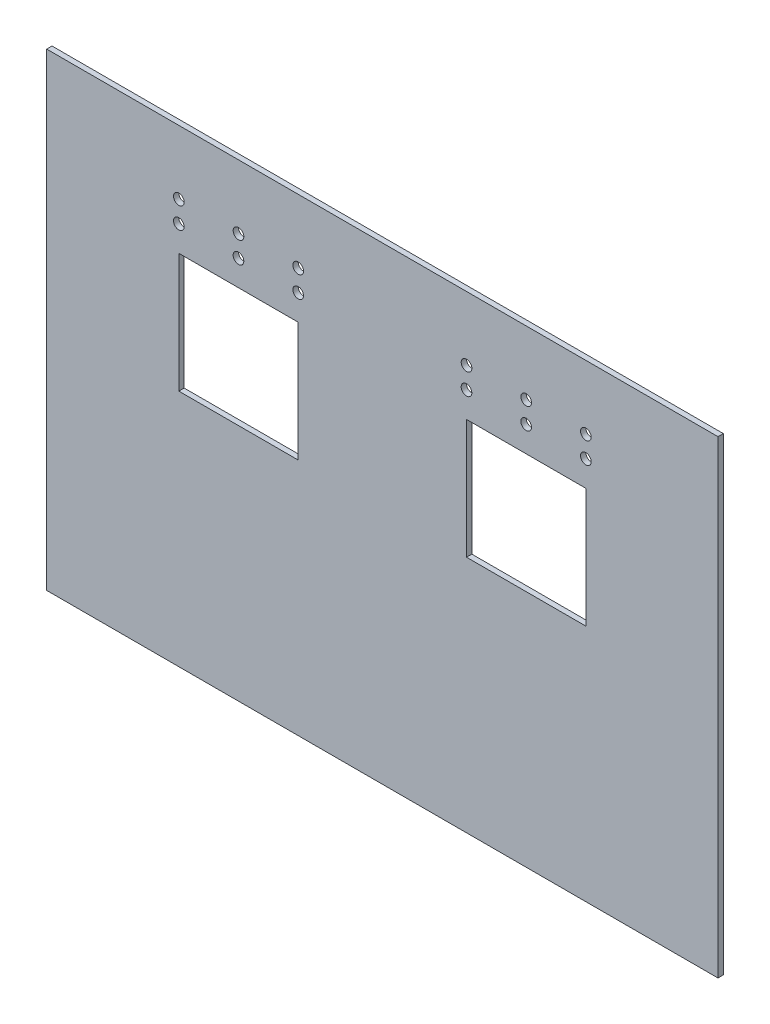
ISO-10303-21;
HEADER;
FILE_DESCRIPTION(('STEP AP214'),'2;1');
FILE_NAME('part.step','',(''),(''),'','','');
FILE_SCHEMA(('AUTOMOTIVE_DESIGN { 1 0 10303 214 1 1 1 1 }'));
ENDSEC;
DATA;
#1=APPLICATION_CONTEXT('core data for automotive mechanical design processes');
#2=APPLICATION_PROTOCOL_DEFINITION('international standard','automotive_design',2000,#1);
#3=PRODUCT_CONTEXT('',#1,'mechanical');
#4=PRODUCT('Part','Part','',(#3));
#5=PRODUCT_RELATED_PRODUCT_CATEGORY('part','',(#4));
#6=PRODUCT_DEFINITION_FORMATION('','',#4);
#7=PRODUCT_DEFINITION_CONTEXT('part definition',#1,'design');
#8=PRODUCT_DEFINITION('design','',#6,#7);
#9=PRODUCT_DEFINITION_SHAPE('','',#8);
#10=(LENGTH_UNIT() NAMED_UNIT(*) SI_UNIT(.MILLI.,.METRE.));
#11=(NAMED_UNIT(*) PLANE_ANGLE_UNIT() SI_UNIT($,.RADIAN.));
#12=(NAMED_UNIT(*) SI_UNIT($,.STERADIAN.) SOLID_ANGLE_UNIT());
#13=UNCERTAINTY_MEASURE_WITH_UNIT(LENGTH_MEASURE(1.E-05),#10,'distance_accuracy_value','');
#14=(GEOMETRIC_REPRESENTATION_CONTEXT(3) GLOBAL_UNCERTAINTY_ASSIGNED_CONTEXT((#13)) GLOBAL_UNIT_ASSIGNED_CONTEXT((#10,
#11,#12)) REPRESENTATION_CONTEXT('',''));
#15=CARTESIAN_POINT('',(0.,0.,0.));
#16=DIRECTION('',(0.,0.,1.));
#17=DIRECTION('',(1.,0.,0.));
#18=AXIS2_PLACEMENT_3D('',#15,#16,#17);
#19=CARTESIAN_POINT('',(0.,0.,3.175));
#20=DIRECTION('',(0.,0.,1.));
#21=DIRECTION('',(1.,0.,0.));
#22=AXIS2_PLACEMENT_3D('',#19,#20,#21);
#23=PLANE('',#22);
#24=CARTESIAN_POINT('',(85.7249999999999,101.6,3.175));
#25=DIRECTION('',(0.,0.,1.));
#26=DIRECTION('',(-1.,0.,0.));
#27=AXIS2_PLACEMENT_3D('',#24,#25,#26);
#28=CIRCLE('',#27,3.175);
#29=CARTESIAN_POINT('',(82.5499999999999,101.6,3.175));
#30=VERTEX_POINT('',#29);
#31=EDGE_CURVE('E363',#30,#30,#28,.T.);
#32=ORIENTED_EDGE('',*,*,#31,.F.);
#33=EDGE_LOOP('',(#32));
#34=FACE_BOUND('',#33,.T.);
#35=CARTESIAN_POINT('',(50.1649999999999,88.9,3.175));
#36=DIRECTION('',(0.,0.,1.));
#37=DIRECTION('',(-1.,0.,0.));
#38=AXIS2_PLACEMENT_3D('',#35,#36,#37);
#39=CIRCLE('',#38,3.175);
#40=CARTESIAN_POINT('',(46.9899999999999,88.9,3.175));
#41=VERTEX_POINT('',#40);
#42=EDGE_CURVE('E375',#41,#41,#39,.T.);
#43=ORIENTED_EDGE('',*,*,#42,.F.);
#44=EDGE_LOOP('',(#43));
#45=FACE_BOUND('',#44,.T.);
#46=CARTESIAN_POINT('',(121.285,88.9,3.175));
#47=DIRECTION('',(0.,0.,1.));
#48=DIRECTION('',(-1.,0.,0.));
#49=AXIS2_PLACEMENT_3D('',#46,#47,#48);
#50=CIRCLE('',#49,3.175);
#51=CARTESIAN_POINT('',(118.11,88.9,3.175));
#52=VERTEX_POINT('',#51);
#53=EDGE_CURVE('E387',#52,#52,#50,.T.);
#54=ORIENTED_EDGE('',*,*,#53,.F.);
#55=EDGE_LOOP('',(#54));
#56=FACE_BOUND('',#55,.T.);
#57=CARTESIAN_POINT('',(-85.7249999999999,101.6,3.175));
#58=DIRECTION('',(0.,0.,1.));
#59=DIRECTION('',(1.,0.,0.));
#60=AXIS2_PLACEMENT_3D('',#57,#58,#59);
#61=CIRCLE('',#60,3.175);
#62=CARTESIAN_POINT('',(-82.5499999999999,101.6,3.175));
#63=VERTEX_POINT('',#62);
#64=EDGE_CURVE('E399',#63,#63,#61,.T.);
#65=ORIENTED_EDGE('',*,*,#64,.F.);
#66=EDGE_LOOP('',(#65));
#67=FACE_BOUND('',#66,.T.);
#68=CARTESIAN_POINT('',(-50.1649999999999,88.9,3.175));
#69=DIRECTION('',(0.,0.,1.));
#70=DIRECTION('',(1.,0.,0.));
#71=AXIS2_PLACEMENT_3D('',#68,#69,#70);
#72=CIRCLE('',#71,3.175);
#73=CARTESIAN_POINT('',(-46.9899999999999,88.9,3.175));
#74=VERTEX_POINT('',#73);
#75=EDGE_CURVE('E411',#74,#74,#72,.T.);
#76=ORIENTED_EDGE('',*,*,#75,.F.);
#77=EDGE_LOOP('',(#76));
#78=FACE_BOUND('',#77,.T.);
#79=CARTESIAN_POINT('',(-85.7249999999999,88.9,3.175));
#80=DIRECTION('',(0.,0.,1.));
#81=DIRECTION('',(1.,0.,0.));
#82=AXIS2_PLACEMENT_3D('',#79,#80,#81);
#83=CIRCLE('',#82,3.175);
#84=CARTESIAN_POINT('',(-82.5499999999999,88.9,3.175));
#85=VERTEX_POINT('',#84);
#86=EDGE_CURVE('E155',#85,#85,#83,.T.);
#87=ORIENTED_EDGE('',*,*,#86,.F.);
#88=EDGE_LOOP('',(#87));
#89=FACE_BOUND('',#88,.T.);
#90=DIRECTION('',(0.,1.,0.));
#91=VECTOR('',#90,1.);
#92=CARTESIAN_POINT('',(200.025,139.7,3.175));
#93=LINE('',#92,#91);
#94=CARTESIAN_POINT('',(200.025,-139.7,3.175));
#95=VERTEX_POINT('',#94);
#96=CARTESIAN_POINT('',(200.025,139.7,3.175));
#97=VERTEX_POINT('',#96);
#98=EDGE_CURVE('E196',#95,#97,#93,.T.);
#99=ORIENTED_EDGE('',*,*,#98,.T.);
#100=DIRECTION('',(-1.,0.,0.));
#101=VECTOR('',#100,1.);
#102=CARTESIAN_POINT('',(-200.025,139.7,3.175));
#103=LINE('',#102,#101);
#104=CARTESIAN_POINT('',(-200.025,139.7,3.175));
#105=VERTEX_POINT('',#104);
#106=EDGE_CURVE('E199',#97,#105,#103,.T.);
#107=ORIENTED_EDGE('',*,*,#106,.T.);
#108=DIRECTION('',(0.,-1.,0.));
#109=VECTOR('',#108,1.);
#110=CARTESIAN_POINT('',(-200.025,139.7,3.175));
#111=LINE('',#110,#109);
#112=CARTESIAN_POINT('',(-200.025,-139.7,3.175));
#113=VERTEX_POINT('',#112);
#114=EDGE_CURVE('E202',#105,#113,#111,.T.);
#115=ORIENTED_EDGE('',*,*,#114,.T.);
#116=DIRECTION('',(1.,0.,0.));
#117=VECTOR('',#116,1.);
#118=CARTESIAN_POINT('',(-200.025,-139.7,3.175));
#119=LINE('',#118,#117);
#120=EDGE_CURVE('E204',#113,#95,#119,.T.);
#121=ORIENTED_EDGE('',*,*,#120,.T.);
#122=EDGE_LOOP('',(#99,#107,#115,#121));
#123=FACE_BOUND('',#122,.T.);
#124=DIRECTION('',(-1.,0.,0.));
#125=VECTOR('',#124,1.);
#126=CARTESIAN_POINT('',(-121.285,73.66,3.175));
#127=LINE('',#126,#125);
#128=CARTESIAN_POINT('',(-50.1649999999999,73.66,3.175));
#129=VERTEX_POINT('',#128);
#130=CARTESIAN_POINT('',(-121.285,73.66,3.175));
#131=VERTEX_POINT('',#130);
#132=EDGE_CURVE('E167',#129,#131,#127,.T.);
#133=ORIENTED_EDGE('',*,*,#132,.F.);
#134=DIRECTION('',(0.,1.,0.));
#135=VECTOR('',#134,1.);
#136=CARTESIAN_POINT('',(-50.1649999999999,73.66,3.175));
#137=LINE('',#136,#135);
#138=CARTESIAN_POINT('',(-50.1649999999999,2.53999999999999,3.175));
#139=VERTEX_POINT('',#138);
#140=EDGE_CURVE('E165',#139,#129,#137,.T.);
#141=ORIENTED_EDGE('',*,*,#140,.F.);
#142=DIRECTION('',(1.,0.,0.));
#143=VECTOR('',#142,1.);
#144=CARTESIAN_POINT('',(-121.285,2.53999999999999,3.175));
#145=LINE('',#144,#143);
#146=CARTESIAN_POINT('',(-121.285,2.53999999999999,3.175));
#147=VERTEX_POINT('',#146);
#148=EDGE_CURVE('E173',#147,#139,#145,.T.);
#149=ORIENTED_EDGE('',*,*,#148,.F.);
#150=DIRECTION('',(0.,-1.,0.));
#151=VECTOR('',#150,1.);
#152=CARTESIAN_POINT('',(-121.285,73.66,3.175));
#153=LINE('',#152,#151);
#154=EDGE_CURVE('E170',#131,#147,#153,.T.);
#155=ORIENTED_EDGE('',*,*,#154,.F.);
#156=EDGE_LOOP('',(#133,#141,#149,#155));
#157=FACE_BOUND('',#156,.T.);
#158=DIRECTION('',(-1.,0.,0.));
#159=VECTOR('',#158,1.);
#160=CARTESIAN_POINT('',(121.285,73.66,3.175));
#161=LINE('',#160,#159);
#162=CARTESIAN_POINT('',(121.285,73.66,3.175));
#163=VERTEX_POINT('',#162);
#164=CARTESIAN_POINT('',(50.1649999999999,73.66,3.175));
#165=VERTEX_POINT('',#164);
#166=EDGE_CURVE('E134',#163,#165,#161,.T.);
#167=ORIENTED_EDGE('',*,*,#166,.F.);
#168=DIRECTION('',(0.,1.,0.));
#169=VECTOR('',#168,1.);
#170=CARTESIAN_POINT('',(121.285,73.66,3.175));
#171=LINE('',#170,#169);
#172=CARTESIAN_POINT('',(121.285,2.53999999999999,3.175));
#173=VERTEX_POINT('',#172);
#174=EDGE_CURVE('E126',#173,#163,#171,.T.);
#175=ORIENTED_EDGE('',*,*,#174,.F.);
#176=DIRECTION('',(1.,0.,0.));
#177=VECTOR('',#176,1.);
#178=CARTESIAN_POINT('',(121.285,2.53999999999999,3.175));
#179=LINE('',#178,#177);
#180=CARTESIAN_POINT('',(50.1649999999999,2.53999999999999,3.175));
#181=VERTEX_POINT('',#180);
#182=EDGE_CURVE('E149',#181,#173,#179,.T.);
#183=ORIENTED_EDGE('',*,*,#182,.F.);
#184=DIRECTION('',(0.,-1.,0.));
#185=VECTOR('',#184,1.);
#186=CARTESIAN_POINT('',(50.1649999999999,73.66,3.175));
#187=LINE('',#186,#185);
#188=EDGE_CURVE('E147',#165,#181,#187,.T.);
#189=ORIENTED_EDGE('',*,*,#188,.F.);
#190=EDGE_LOOP('',(#167,#175,#183,#189));
#191=FACE_BOUND('',#190,.T.);
#192=CARTESIAN_POINT('',(-121.285,88.9,3.175));
#193=DIRECTION('',(0.,0.,1.));
#194=DIRECTION('',(1.,0.,0.));
#195=AXIS2_PLACEMENT_3D('',#192,#193,#194);
#196=CIRCLE('',#195,3.175);
#197=CARTESIAN_POINT('',(-118.11,88.9,3.175));
#198=VERTEX_POINT('',#197);
#199=EDGE_CURVE('E417',#198,#198,#196,.T.);
#200=ORIENTED_EDGE('',*,*,#199,.F.);
#201=EDGE_LOOP('',(#200));
#202=FACE_BOUND('',#201,.T.);
#203=CARTESIAN_POINT('',(-50.1649999999999,101.6,3.175));
#204=DIRECTION('',(0.,0.,1.));
#205=DIRECTION('',(1.,0.,0.));
#206=AXIS2_PLACEMENT_3D('',#203,#204,#205);
#207=CIRCLE('',#206,3.175);
#208=CARTESIAN_POINT('',(-46.9899999999999,101.6,3.175));
#209=VERTEX_POINT('',#208);
#210=EDGE_CURVE('E405',#209,#209,#207,.T.);
#211=ORIENTED_EDGE('',*,*,#210,.F.);
#212=EDGE_LOOP('',(#211));
#213=FACE_BOUND('',#212,.T.);
#214=CARTESIAN_POINT('',(-121.285,101.6,3.175));
#215=DIRECTION('',(0.,0.,1.));
#216=DIRECTION('',(1.,0.,0.));
#217=AXIS2_PLACEMENT_3D('',#214,#215,#216);
#218=CIRCLE('',#217,3.175);
#219=CARTESIAN_POINT('',(-118.11,101.6,3.175));
#220=VERTEX_POINT('',#219);
#221=EDGE_CURVE('E393',#220,#220,#218,.T.);
#222=ORIENTED_EDGE('',*,*,#221,.F.);
#223=EDGE_LOOP('',(#222));
#224=FACE_BOUND('',#223,.T.);
#225=CARTESIAN_POINT('',(85.7249999999999,88.9,3.175));
#226=DIRECTION('',(0.,0.,1.));
#227=DIRECTION('',(-1.,0.,0.));
#228=AXIS2_PLACEMENT_3D('',#225,#226,#227);
#229=CIRCLE('',#228,3.175);
#230=CARTESIAN_POINT('',(82.5499999999999,88.9,3.175));
#231=VERTEX_POINT('',#230);
#232=EDGE_CURVE('E381',#231,#231,#229,.T.);
#233=ORIENTED_EDGE('',*,*,#232,.F.);
#234=EDGE_LOOP('',(#233));
#235=FACE_BOUND('',#234,.T.);
#236=CARTESIAN_POINT('',(50.1649999999999,101.6,3.175));
#237=DIRECTION('',(0.,0.,1.));
#238=DIRECTION('',(-1.,0.,0.));
#239=AXIS2_PLACEMENT_3D('',#236,#237,#238);
#240=CIRCLE('',#239,3.175);
#241=CARTESIAN_POINT('',(46.9899999999999,101.6,3.175));
#242=VERTEX_POINT('',#241);
#243=EDGE_CURVE('E369',#242,#242,#240,.T.);
#244=ORIENTED_EDGE('',*,*,#243,.F.);
#245=EDGE_LOOP('',(#244));
#246=FACE_BOUND('',#245,.T.);
#247=CARTESIAN_POINT('',(121.285,101.6,3.175));
#248=DIRECTION('',(0.,0.,1.));
#249=DIRECTION('',(-1.,0.,0.));
#250=AXIS2_PLACEMENT_3D('',#247,#248,#249);
#251=CIRCLE('',#250,3.175);
#252=CARTESIAN_POINT('',(118.11,101.6,3.175));
#253=VERTEX_POINT('',#252);
#254=EDGE_CURVE('E354',#253,#253,#251,.T.);
#255=ORIENTED_EDGE('',*,*,#254,.F.);
#256=EDGE_LOOP('',(#255));
#257=FACE_BOUND('',#256,.T.);
#258=ADVANCED_FACE('F37',(#34,#45,#56,#67,#78,#89,#123,#157,#191,#202,#213,#224,#235,#246,#257),
#23,.T.);
#259=CARTESIAN_POINT('',(0.,0.,0.));
#260=DIRECTION('',(0.,0.,1.));
#261=DIRECTION('',(1.,0.,0.));
#262=AXIS2_PLACEMENT_3D('',#259,#260,#261);
#263=PLANE('',#262);
#264=DIRECTION('',(0.,1.,0.));
#265=VECTOR('',#264,1.);
#266=CARTESIAN_POINT('',(-50.1649999999999,73.66,0.));
#267=LINE('',#266,#265);
#268=CARTESIAN_POINT('',(-50.1649999999999,2.53999999999999,0.));
#269=VERTEX_POINT('',#268);
#270=CARTESIAN_POINT('',(-50.1649999999999,73.66,0.));
#271=VERTEX_POINT('',#270);
#272=EDGE_CURVE('E142',#269,#271,#267,.T.);
#273=ORIENTED_EDGE('',*,*,#272,.T.);
#274=DIRECTION('',(-1.,0.,0.));
#275=VECTOR('',#274,1.);
#276=CARTESIAN_POINT('',(-121.285,73.66,0.));
#277=LINE('',#276,#275);
#278=CARTESIAN_POINT('',(-121.285,73.66,0.));
#279=VERTEX_POINT('',#278);
#280=EDGE_CURVE('E178',#271,#279,#277,.T.);
#281=ORIENTED_EDGE('',*,*,#280,.T.);
#282=DIRECTION('',(0.,-1.,0.));
#283=VECTOR('',#282,1.);
#284=CARTESIAN_POINT('',(-121.285,73.66,0.));
#285=LINE('',#284,#283);
#286=CARTESIAN_POINT('',(-121.285,2.53999999999999,0.));
#287=VERTEX_POINT('',#286);
#288=EDGE_CURVE('E181',#279,#287,#285,.T.);
#289=ORIENTED_EDGE('',*,*,#288,.T.);
#290=DIRECTION('',(1.,0.,0.));
#291=VECTOR('',#290,1.);
#292=CARTESIAN_POINT('',(-121.285,2.53999999999999,0.));
#293=LINE('',#292,#291);
#294=EDGE_CURVE('E168',#287,#269,#293,.T.);
#295=ORIENTED_EDGE('',*,*,#294,.T.);
#296=EDGE_LOOP('',(#273,#281,#289,#295));
#297=FACE_BOUND('',#296,.T.);
#298=DIRECTION('',(0.,1.,0.));
#299=VECTOR('',#298,1.);
#300=CARTESIAN_POINT('',(200.025,139.7,0.));
#301=LINE('',#300,#299);
#302=CARTESIAN_POINT('',(200.025,-139.7,0.));
#303=VERTEX_POINT('',#302);
#304=CARTESIAN_POINT('',(200.025,139.7,0.));
#305=VERTEX_POINT('',#304);
#306=EDGE_CURVE('E195',#303,#305,#301,.T.);
#307=ORIENTED_EDGE('',*,*,#306,.F.);
#308=DIRECTION('',(1.,0.,0.));
#309=VECTOR('',#308,1.);
#310=CARTESIAN_POINT('',(-200.025,-139.7,0.));
#311=LINE('',#310,#309);
#312=CARTESIAN_POINT('',(-200.025,-139.7,0.));
#313=VERTEX_POINT('',#312);
#314=EDGE_CURVE('E200',#313,#303,#311,.T.);
#315=ORIENTED_EDGE('',*,*,#314,.F.);
#316=DIRECTION('',(0.,-1.,0.));
#317=VECTOR('',#316,1.);
#318=CARTESIAN_POINT('',(-200.025,139.7,0.));
#319=LINE('',#318,#317);
#320=CARTESIAN_POINT('',(-200.025,139.7,0.));
#321=VERTEX_POINT('',#320);
#322=EDGE_CURVE('E211',#321,#313,#319,.T.);
#323=ORIENTED_EDGE('',*,*,#322,.F.);
#324=DIRECTION('',(-1.,0.,0.));
#325=VECTOR('',#324,1.);
#326=CARTESIAN_POINT('',(-200.025,139.7,0.));
#327=LINE('',#326,#325);
#328=EDGE_CURVE('E209',#305,#321,#327,.T.);
#329=ORIENTED_EDGE('',*,*,#328,.F.);
#330=EDGE_LOOP('',(#307,#315,#323,#329));
#331=FACE_BOUND('',#330,.T.);
#332=DIRECTION('',(0.,1.,0.));
#333=VECTOR('',#332,1.);
#334=CARTESIAN_POINT('',(121.285,73.66,0.));
#335=LINE('',#334,#333);
#336=CARTESIAN_POINT('',(121.285,2.53999999999999,0.));
#337=VERTEX_POINT('',#336);
#338=CARTESIAN_POINT('',(121.285,73.66,0.));
#339=VERTEX_POINT('',#338);
#340=EDGE_CURVE('E60',#337,#339,#335,.T.);
#341=ORIENTED_EDGE('',*,*,#340,.T.);
#342=DIRECTION('',(-1.,0.,0.));
#343=VECTOR('',#342,1.);
#344=CARTESIAN_POINT('',(121.285,73.66,0.));
#345=LINE('',#344,#343);
#346=CARTESIAN_POINT('',(50.1649999999999,73.66,0.));
#347=VERTEX_POINT('',#346);
#348=EDGE_CURVE('E141',#339,#347,#345,.T.);
#349=ORIENTED_EDGE('',*,*,#348,.T.);
#350=DIRECTION('',(0.,-1.,0.));
#351=VECTOR('',#350,1.);
#352=CARTESIAN_POINT('',(50.1649999999999,73.66,0.));
#353=LINE('',#352,#351);
#354=CARTESIAN_POINT('',(50.1649999999999,2.53999999999999,0.));
#355=VERTEX_POINT('',#354);
#356=EDGE_CURVE('E157',#347,#355,#353,.T.);
#357=ORIENTED_EDGE('',*,*,#356,.T.);
#358=DIRECTION('',(1.,0.,0.));
#359=VECTOR('',#358,1.);
#360=CARTESIAN_POINT('',(121.285,2.53999999999999,0.));
#361=LINE('',#360,#359);
#362=EDGE_CURVE('E135',#355,#337,#361,.T.);
#363=ORIENTED_EDGE('',*,*,#362,.T.);
#364=EDGE_LOOP('',(#341,#349,#357,#363));
#365=FACE_BOUND('',#364,.T.);
#366=CARTESIAN_POINT('',(-85.7249999999999,88.9,0.));
#367=DIRECTION('',(0.,0.,1.));
#368=DIRECTION('',(1.,0.,0.));
#369=AXIS2_PLACEMENT_3D('',#366,#367,#368);
#370=CIRCLE('',#369,3.175);
#371=CARTESIAN_POINT('',(-82.5499999999999,88.9,0.));
#372=VERTEX_POINT('',#371);
#373=EDGE_CURVE('E420',#372,#372,#370,.T.);
#374=ORIENTED_EDGE('',*,*,#373,.T.);
#375=EDGE_LOOP('',(#374));
#376=FACE_BOUND('',#375,.T.);
#377=CARTESIAN_POINT('',(-121.285,88.9,0.));
#378=DIRECTION('',(0.,0.,1.));
#379=DIRECTION('',(1.,0.,0.));
#380=AXIS2_PLACEMENT_3D('',#377,#378,#379);
#381=CIRCLE('',#380,3.175);
#382=CARTESIAN_POINT('',(-118.11,88.9,0.));
#383=VERTEX_POINT('',#382);
#384=EDGE_CURVE('E414',#383,#383,#381,.T.);
#385=ORIENTED_EDGE('',*,*,#384,.T.);
#386=EDGE_LOOP('',(#385));
#387=FACE_BOUND('',#386,.T.);
#388=CARTESIAN_POINT('',(-50.1649999999999,88.9,0.));
#389=DIRECTION('',(0.,0.,1.));
#390=DIRECTION('',(1.,0.,0.));
#391=AXIS2_PLACEMENT_3D('',#388,#389,#390);
#392=CIRCLE('',#391,3.175);
#393=CARTESIAN_POINT('',(-46.9899999999999,88.9,0.));
#394=VERTEX_POINT('',#393);
#395=EDGE_CURVE('E408',#394,#394,#392,.T.);
#396=ORIENTED_EDGE('',*,*,#395,.T.);
#397=EDGE_LOOP('',(#396));
#398=FACE_BOUND('',#397,.T.);
#399=CARTESIAN_POINT('',(-50.1649999999999,101.6,0.));
#400=DIRECTION('',(0.,0.,1.));
#401=DIRECTION('',(1.,0.,0.));
#402=AXIS2_PLACEMENT_3D('',#399,#400,#401);
#403=CIRCLE('',#402,3.175);
#404=CARTESIAN_POINT('',(-46.9899999999999,101.6,0.));
#405=VERTEX_POINT('',#404);
#406=EDGE_CURVE('E402',#405,#405,#403,.T.);
#407=ORIENTED_EDGE('',*,*,#406,.T.);
#408=EDGE_LOOP('',(#407));
#409=FACE_BOUND('',#408,.T.);
#410=CARTESIAN_POINT('',(-85.7249999999999,101.6,0.));
#411=DIRECTION('',(0.,0.,1.));
#412=DIRECTION('',(1.,0.,0.));
#413=AXIS2_PLACEMENT_3D('',#410,#411,#412);
#414=CIRCLE('',#413,3.175);
#415=CARTESIAN_POINT('',(-82.5499999999999,101.6,0.));
#416=VERTEX_POINT('',#415);
#417=EDGE_CURVE('E396',#416,#416,#414,.T.);
#418=ORIENTED_EDGE('',*,*,#417,.T.);
#419=EDGE_LOOP('',(#418));
#420=FACE_BOUND('',#419,.T.);
#421=CARTESIAN_POINT('',(-121.285,101.6,0.));
#422=DIRECTION('',(0.,0.,1.));
#423=DIRECTION('',(1.,0.,0.));
#424=AXIS2_PLACEMENT_3D('',#421,#422,#423);
#425=CIRCLE('',#424,3.175);
#426=CARTESIAN_POINT('',(-118.11,101.6,0.));
#427=VERTEX_POINT('',#426);
#428=EDGE_CURVE('E390',#427,#427,#425,.T.);
#429=ORIENTED_EDGE('',*,*,#428,.T.);
#430=EDGE_LOOP('',(#429));
#431=FACE_BOUND('',#430,.T.);
#432=CARTESIAN_POINT('',(121.285,88.9,0.));
#433=DIRECTION('',(0.,0.,1.));
#434=DIRECTION('',(-1.,0.,0.));
#435=AXIS2_PLACEMENT_3D('',#432,#433,#434);
#436=CIRCLE('',#435,3.175);
#437=CARTESIAN_POINT('',(118.11,88.9,0.));
#438=VERTEX_POINT('',#437);
#439=EDGE_CURVE('E384',#438,#438,#436,.T.);
#440=ORIENTED_EDGE('',*,*,#439,.T.);
#441=EDGE_LOOP('',(#440));
#442=FACE_BOUND('',#441,.T.);
#443=CARTESIAN_POINT('',(85.7249999999999,88.9,0.));
#444=DIRECTION('',(0.,0.,1.));
#445=DIRECTION('',(-1.,0.,0.));
#446=AXIS2_PLACEMENT_3D('',#443,#444,#445);
#447=CIRCLE('',#446,3.175);
#448=CARTESIAN_POINT('',(82.5499999999999,88.9,0.));
#449=VERTEX_POINT('',#448);
#450=EDGE_CURVE('E378',#449,#449,#447,.T.);
#451=ORIENTED_EDGE('',*,*,#450,.T.);
#452=EDGE_LOOP('',(#451));
#453=FACE_BOUND('',#452,.T.);
#454=CARTESIAN_POINT('',(50.1649999999999,88.9,0.));
#455=DIRECTION('',(0.,0.,1.));
#456=DIRECTION('',(-1.,0.,0.));
#457=AXIS2_PLACEMENT_3D('',#454,#455,#456);
#458=CIRCLE('',#457,3.175);
#459=CARTESIAN_POINT('',(46.9899999999999,88.9,0.));
#460=VERTEX_POINT('',#459);
#461=EDGE_CURVE('E372',#460,#460,#458,.T.);
#462=ORIENTED_EDGE('',*,*,#461,.T.);
#463=EDGE_LOOP('',(#462));
#464=FACE_BOUND('',#463,.T.);
#465=CARTESIAN_POINT('',(50.1649999999999,101.6,0.));
#466=DIRECTION('',(0.,0.,1.));
#467=DIRECTION('',(-1.,0.,0.));
#468=AXIS2_PLACEMENT_3D('',#465,#466,#467);
#469=CIRCLE('',#468,3.175);
#470=CARTESIAN_POINT('',(46.9899999999999,101.6,0.));
#471=VERTEX_POINT('',#470);
#472=EDGE_CURVE('E366',#471,#471,#469,.T.);
#473=ORIENTED_EDGE('',*,*,#472,.T.);
#474=EDGE_LOOP('',(#473));
#475=FACE_BOUND('',#474,.T.);
#476=CARTESIAN_POINT('',(85.7249999999999,101.6,0.));
#477=DIRECTION('',(0.,0.,1.));
#478=DIRECTION('',(-1.,0.,0.));
#479=AXIS2_PLACEMENT_3D('',#476,#477,#478);
#480=CIRCLE('',#479,3.175);
#481=CARTESIAN_POINT('',(82.5499999999999,101.6,0.));
#482=VERTEX_POINT('',#481);
#483=EDGE_CURVE('E360',#482,#482,#480,.T.);
#484=ORIENTED_EDGE('',*,*,#483,.T.);
#485=EDGE_LOOP('',(#484));
#486=FACE_BOUND('',#485,.T.);
#487=CARTESIAN_POINT('',(121.285,101.6,0.));
#488=DIRECTION('',(0.,0.,1.));
#489=DIRECTION('',(-1.,0.,0.));
#490=AXIS2_PLACEMENT_3D('',#487,#488,#489);
#491=CIRCLE('',#490,3.175);
#492=CARTESIAN_POINT('',(118.11,101.6,0.));
#493=VERTEX_POINT('',#492);
#494=EDGE_CURVE('E357',#493,#493,#491,.T.);
#495=ORIENTED_EDGE('',*,*,#494,.T.);
#496=EDGE_LOOP('',(#495));
#497=FACE_BOUND('',#496,.T.);
#498=ADVANCED_FACE('F229',(#297,#331,#365,#376,#387,#398,#409,#420,#431,#442,#453,#464,#475,
#486,#497),#263,.F.);
#499=CARTESIAN_POINT('',(200.025,139.7,3.175));
#500=DIRECTION('',(-1.,0.,0.));
#501=DIRECTION('',(0.,-1.,0.));
#502=AXIS2_PLACEMENT_3D('',#499,#500,#501);
#503=PLANE('',#502);
#504=ORIENTED_EDGE('',*,*,#306,.T.);
#505=DIRECTION('',(0.,0.,-1.));
#506=VECTOR('',#505,1.);
#507=CARTESIAN_POINT('',(200.025,139.7,3.175));
#508=LINE('',#507,#506);
#509=EDGE_CURVE('E11',#97,#305,#508,.T.);
#510=ORIENTED_EDGE('',*,*,#509,.F.);
#511=ORIENTED_EDGE('',*,*,#98,.F.);
#512=DIRECTION('',(0.,0.,-1.));
#513=VECTOR('',#512,1.);
#514=CARTESIAN_POINT('',(200.025,-139.7,3.175));
#515=LINE('',#514,#513);
#516=EDGE_CURVE('E206',#95,#303,#515,.T.);
#517=ORIENTED_EDGE('',*,*,#516,.T.);
#518=EDGE_LOOP('',(#504,#510,#511,#517));
#519=FACE_BOUND('',#518,.T.);
#520=ADVANCED_FACE('F39',(#519),#503,.F.);
#521=CARTESIAN_POINT('',(-200.025,139.7,3.175));
#522=DIRECTION('',(0.,-1.,0.));
#523=DIRECTION('',(0.,0.,-1.));
#524=AXIS2_PLACEMENT_3D('',#521,#522,#523);
#525=PLANE('',#524);
#526=ORIENTED_EDGE('',*,*,#328,.T.);
#527=DIRECTION('',(0.,0.,-1.));
#528=VECTOR('',#527,1.);
#529=CARTESIAN_POINT('',(-200.025,139.7,3.175));
#530=LINE('',#529,#528);
#531=EDGE_CURVE('E45',#105,#321,#530,.T.);
#532=ORIENTED_EDGE('',*,*,#531,.F.);
#533=ORIENTED_EDGE('',*,*,#106,.F.);
#534=ORIENTED_EDGE('',*,*,#509,.T.);
#535=EDGE_LOOP('',(#526,#532,#533,#534));
#536=FACE_BOUND('',#535,.T.);
#537=ADVANCED_FACE('F240',(#536),#525,.F.);
#538=CARTESIAN_POINT('',(-200.025,139.7,3.175));
#539=DIRECTION('',(1.,0.,0.));
#540=DIRECTION('',(0.,0.,-1.));
#541=AXIS2_PLACEMENT_3D('',#538,#539,#540);
#542=PLANE('',#541);
#543=ORIENTED_EDGE('',*,*,#322,.T.);
#544=DIRECTION('',(0.,0.,-1.));
#545=VECTOR('',#544,1.);
#546=CARTESIAN_POINT('',(-200.025,-139.7,3.175));
#547=LINE('',#546,#545);
#548=EDGE_CURVE('E216',#113,#313,#547,.T.);
#549=ORIENTED_EDGE('',*,*,#548,.F.);
#550=ORIENTED_EDGE('',*,*,#114,.F.);
#551=ORIENTED_EDGE('',*,*,#531,.T.);
#552=EDGE_LOOP('',(#543,#549,#550,#551));
#553=FACE_BOUND('',#552,.T.);
#554=ADVANCED_FACE('F223',(#553),#542,.F.);
#555=CARTESIAN_POINT('',(-200.025,-139.7,3.175));
#556=DIRECTION('',(0.,1.,0.));
#557=DIRECTION('',(0.,0.,1.));
#558=AXIS2_PLACEMENT_3D('',#555,#556,#557);
#559=PLANE('',#558);
#560=ORIENTED_EDGE('',*,*,#314,.T.);
#561=ORIENTED_EDGE('',*,*,#516,.F.);
#562=ORIENTED_EDGE('',*,*,#120,.F.);
#563=ORIENTED_EDGE('',*,*,#548,.T.);
#564=EDGE_LOOP('',(#560,#561,#562,#563));
#565=FACE_BOUND('',#564,.T.);
#566=ADVANCED_FACE('F233',(#565),#559,.F.);
#567=CARTESIAN_POINT('',(-50.1649999999999,73.66,3.175));
#568=DIRECTION('',(-1.,0.,0.));
#569=DIRECTION('',(0.,-1.,0.));
#570=AXIS2_PLACEMENT_3D('',#567,#568,#569);
#571=PLANE('',#570);
#572=ORIENTED_EDGE('',*,*,#272,.F.);
#573=DIRECTION('',(0.,0.,-1.));
#574=VECTOR('',#573,1.);
#575=CARTESIAN_POINT('',(-50.1649999999999,2.53999999999999,3.175));
#576=LINE('',#575,#574);
#577=EDGE_CURVE('E175',#139,#269,#576,.T.);
#578=ORIENTED_EDGE('',*,*,#577,.F.);
#579=ORIENTED_EDGE('',*,*,#140,.T.);
#580=DIRECTION('',(0.,0.,-1.));
#581=VECTOR('',#580,1.);
#582=CARTESIAN_POINT('',(-50.1649999999999,73.66,3.175));
#583=LINE('',#582,#581);
#584=EDGE_CURVE('E192',#129,#271,#583,.T.);
#585=ORIENTED_EDGE('',*,*,#584,.T.);
#586=EDGE_LOOP('',(#572,#578,#579,#585));
#587=FACE_BOUND('',#586,.T.);
#588=ADVANCED_FACE('F258',(#587),#571,.T.);
#589=CARTESIAN_POINT('',(-121.285,73.66,3.175));
#590=DIRECTION('',(0.,-1.,0.));
#591=DIRECTION('',(0.,0.,-1.));
#592=AXIS2_PLACEMENT_3D('',#589,#590,#591);
#593=PLANE('',#592);
#594=ORIENTED_EDGE('',*,*,#280,.F.);
#595=ORIENTED_EDGE('',*,*,#584,.F.);
#596=ORIENTED_EDGE('',*,*,#132,.T.);
#597=DIRECTION('',(0.,0.,-1.));
#598=VECTOR('',#597,1.);
#599=CARTESIAN_POINT('',(-121.285,73.66,3.175));
#600=LINE('',#599,#598);
#601=EDGE_CURVE('E190',#131,#279,#600,.T.);
#602=ORIENTED_EDGE('',*,*,#601,.T.);
#603=EDGE_LOOP('',(#594,#595,#596,#602));
#604=FACE_BOUND('',#603,.T.);
#605=ADVANCED_FACE('F265',(#604),#593,.T.);
#606=CARTESIAN_POINT('',(-121.285,73.66,3.175));
#607=DIRECTION('',(1.,0.,0.));
#608=DIRECTION('',(0.,1.,0.));
#609=AXIS2_PLACEMENT_3D('',#606,#607,#608);
#610=PLANE('',#609);
#611=ORIENTED_EDGE('',*,*,#288,.F.);
#612=ORIENTED_EDGE('',*,*,#601,.F.);
#613=ORIENTED_EDGE('',*,*,#154,.T.);
#614=DIRECTION('',(0.,0.,-1.));
#615=VECTOR('',#614,1.);
#616=CARTESIAN_POINT('',(-121.285,2.53999999999999,3.175));
#617=LINE('',#616,#615);
#618=EDGE_CURVE('E188',#147,#287,#617,.T.);
#619=ORIENTED_EDGE('',*,*,#618,.T.);
#620=EDGE_LOOP('',(#611,#612,#613,#619));
#621=FACE_BOUND('',#620,.T.);
#622=ADVANCED_FACE('F270',(#621),#610,.T.);
#623=CARTESIAN_POINT('',(-121.285,2.53999999999999,3.175));
#624=DIRECTION('',(0.,1.,0.));
#625=DIRECTION('',(0.,0.,1.));
#626=AXIS2_PLACEMENT_3D('',#623,#624,#625);
#627=PLANE('',#626);
#628=ORIENTED_EDGE('',*,*,#294,.F.);
#629=ORIENTED_EDGE('',*,*,#618,.F.);
#630=ORIENTED_EDGE('',*,*,#148,.T.);
#631=ORIENTED_EDGE('',*,*,#577,.T.);
#632=EDGE_LOOP('',(#628,#629,#630,#631));
#633=FACE_BOUND('',#632,.T.);
#634=ADVANCED_FACE('F277',(#633),#627,.T.);
#635=CARTESIAN_POINT('',(121.285,73.66,3.175));
#636=DIRECTION('',(-1.,0.,0.));
#637=DIRECTION('',(0.,-1.,0.));
#638=AXIS2_PLACEMENT_3D('',#635,#636,#637);
#639=PLANE('',#638);
#640=ORIENTED_EDGE('',*,*,#340,.F.);
#641=DIRECTION('',(0.,0.,-1.));
#642=VECTOR('',#641,1.);
#643=CARTESIAN_POINT('',(121.285,2.53999999999999,3.175));
#644=LINE('',#643,#642);
#645=EDGE_CURVE('E130',#173,#337,#644,.T.);
#646=ORIENTED_EDGE('',*,*,#645,.F.);
#647=ORIENTED_EDGE('',*,*,#174,.T.);
#648=DIRECTION('',(0.,0.,-1.));
#649=VECTOR('',#648,1.);
#650=CARTESIAN_POINT('',(121.285,73.66,3.175));
#651=LINE('',#650,#649);
#652=EDGE_CURVE('E129',#163,#339,#651,.T.);
#653=ORIENTED_EDGE('',*,*,#652,.T.);
#654=EDGE_LOOP('',(#640,#646,#647,#653));
#655=FACE_BOUND('',#654,.T.);
#656=ADVANCED_FACE('F128',(#655),#639,.T.);
#657=CARTESIAN_POINT('',(121.285,73.66,3.175));
#658=DIRECTION('',(0.,-1.,0.));
#659=DIRECTION('',(0.,0.,-1.));
#660=AXIS2_PLACEMENT_3D('',#657,#658,#659);
#661=PLANE('',#660);
#662=ORIENTED_EDGE('',*,*,#348,.F.);
#663=ORIENTED_EDGE('',*,*,#652,.F.);
#664=ORIENTED_EDGE('',*,*,#166,.T.);
#665=DIRECTION('',(0.,0.,-1.));
#666=VECTOR('',#665,1.);
#667=CARTESIAN_POINT('',(50.1649999999999,73.66,3.175));
#668=LINE('',#667,#666);
#669=EDGE_CURVE('E143',#165,#347,#668,.T.);
#670=ORIENTED_EDGE('',*,*,#669,.T.);
#671=EDGE_LOOP('',(#662,#663,#664,#670));
#672=FACE_BOUND('',#671,.T.);
#673=ADVANCED_FACE('F138',(#672),#661,.T.);
#674=CARTESIAN_POINT('',(50.1649999999999,73.66,3.175));
#675=DIRECTION('',(1.,0.,0.));
#676=DIRECTION('',(0.,1.,0.));
#677=AXIS2_PLACEMENT_3D('',#674,#675,#676);
#678=PLANE('',#677);
#679=ORIENTED_EDGE('',*,*,#356,.F.);
#680=ORIENTED_EDGE('',*,*,#669,.F.);
#681=ORIENTED_EDGE('',*,*,#188,.T.);
#682=DIRECTION('',(0.,0.,-1.));
#683=VECTOR('',#682,1.);
#684=CARTESIAN_POINT('',(50.1649999999999,2.53999999999999,3.175));
#685=LINE('',#684,#683);
#686=EDGE_CURVE('E52',#181,#355,#685,.T.);
#687=ORIENTED_EDGE('',*,*,#686,.T.);
#688=EDGE_LOOP('',(#679,#680,#681,#687));
#689=FACE_BOUND('',#688,.T.);
#690=ADVANCED_FACE('F295',(#689),#678,.T.);
#691=CARTESIAN_POINT('',(121.285,2.53999999999999,3.175));
#692=DIRECTION('',(0.,1.,0.));
#693=DIRECTION('',(0.,0.,1.));
#694=AXIS2_PLACEMENT_3D('',#691,#692,#693);
#695=PLANE('',#694);
#696=ORIENTED_EDGE('',*,*,#362,.F.);
#697=ORIENTED_EDGE('',*,*,#686,.F.);
#698=ORIENTED_EDGE('',*,*,#182,.T.);
#699=ORIENTED_EDGE('',*,*,#645,.T.);
#700=EDGE_LOOP('',(#696,#697,#698,#699));
#701=FACE_BOUND('',#700,.T.);
#702=ADVANCED_FACE('F298',(#701),#695,.T.);
#703=CARTESIAN_POINT('',(-85.7249999999999,88.9,3.175));
#704=DIRECTION('',(0.,0.,-1.));
#705=DIRECTION('',(-1.,0.,0.));
#706=AXIS2_PLACEMENT_3D('',#703,#704,#705);
#707=CYLINDRICAL_SURFACE('',#706,3.175);
#708=ORIENTED_EDGE('',*,*,#86,.T.);
#709=EDGE_LOOP('',(#708));
#710=FACE_BOUND('',#709,.T.);
#711=ORIENTED_EDGE('',*,*,#373,.F.);
#712=EDGE_LOOP('',(#711));
#713=FACE_BOUND('',#712,.T.);
#714=ADVANCED_FACE('F302',(#710,#713),#707,.F.);
#715=CARTESIAN_POINT('',(-121.285,88.9,3.175));
#716=DIRECTION('',(0.,0.,-1.));
#717=DIRECTION('',(-1.,0.,0.));
#718=AXIS2_PLACEMENT_3D('',#715,#716,#717);
#719=CYLINDRICAL_SURFACE('',#718,3.175);
#720=ORIENTED_EDGE('',*,*,#199,.T.);
#721=EDGE_LOOP('',(#720));
#722=FACE_BOUND('',#721,.T.);
#723=ORIENTED_EDGE('',*,*,#384,.F.);
#724=EDGE_LOOP('',(#723));
#725=FACE_BOUND('',#724,.T.);
#726=ADVANCED_FACE('F305',(#722,#725),#719,.F.);
#727=CARTESIAN_POINT('',(-50.1649999999999,88.9,3.175));
#728=DIRECTION('',(0.,0.,-1.));
#729=DIRECTION('',(-1.,0.,0.));
#730=AXIS2_PLACEMENT_3D('',#727,#728,#729);
#731=CYLINDRICAL_SURFACE('',#730,3.175);
#732=ORIENTED_EDGE('',*,*,#75,.T.);
#733=EDGE_LOOP('',(#732));
#734=FACE_BOUND('',#733,.T.);
#735=ORIENTED_EDGE('',*,*,#395,.F.);
#736=EDGE_LOOP('',(#735));
#737=FACE_BOUND('',#736,.T.);
#738=ADVANCED_FACE('F309',(#734,#737),#731,.F.);
#739=CARTESIAN_POINT('',(-50.1649999999999,101.6,3.175));
#740=DIRECTION('',(0.,0.,-1.));
#741=DIRECTION('',(-1.,0.,0.));
#742=AXIS2_PLACEMENT_3D('',#739,#740,#741);
#743=CYLINDRICAL_SURFACE('',#742,3.175);
#744=ORIENTED_EDGE('',*,*,#210,.T.);
#745=EDGE_LOOP('',(#744));
#746=FACE_BOUND('',#745,.T.);
#747=ORIENTED_EDGE('',*,*,#406,.F.);
#748=EDGE_LOOP('',(#747));
#749=FACE_BOUND('',#748,.T.);
#750=ADVANCED_FACE('F313',(#746,#749),#743,.F.);
#751=CARTESIAN_POINT('',(-85.7249999999999,101.6,3.175));
#752=DIRECTION('',(0.,0.,-1.));
#753=DIRECTION('',(-1.,0.,0.));
#754=AXIS2_PLACEMENT_3D('',#751,#752,#753);
#755=CYLINDRICAL_SURFACE('',#754,3.175);
#756=ORIENTED_EDGE('',*,*,#64,.T.);
#757=EDGE_LOOP('',(#756));
#758=FACE_BOUND('',#757,.T.);
#759=ORIENTED_EDGE('',*,*,#417,.F.);
#760=EDGE_LOOP('',(#759));
#761=FACE_BOUND('',#760,.T.);
#762=ADVANCED_FACE('F317',(#758,#761),#755,.F.);
#763=CARTESIAN_POINT('',(-121.285,101.6,3.175));
#764=DIRECTION('',(0.,0.,-1.));
#765=DIRECTION('',(-1.,0.,0.));
#766=AXIS2_PLACEMENT_3D('',#763,#764,#765);
#767=CYLINDRICAL_SURFACE('',#766,3.175);
#768=ORIENTED_EDGE('',*,*,#221,.T.);
#769=EDGE_LOOP('',(#768));
#770=FACE_BOUND('',#769,.T.);
#771=ORIENTED_EDGE('',*,*,#428,.F.);
#772=EDGE_LOOP('',(#771));
#773=FACE_BOUND('',#772,.T.);
#774=ADVANCED_FACE('F321',(#770,#773),#767,.F.);
#775=CARTESIAN_POINT('',(121.285,88.9,3.175));
#776=DIRECTION('',(0.,0.,-1.));
#777=DIRECTION('',(-1.,0.,0.));
#778=AXIS2_PLACEMENT_3D('',#775,#776,#777);
#779=CYLINDRICAL_SURFACE('',#778,3.175);
#780=ORIENTED_EDGE('',*,*,#53,.T.);
#781=EDGE_LOOP('',(#780));
#782=FACE_BOUND('',#781,.T.);
#783=ORIENTED_EDGE('',*,*,#439,.F.);
#784=EDGE_LOOP('',(#783));
#785=FACE_BOUND('',#784,.T.);
#786=ADVANCED_FACE('F325',(#782,#785),#779,.F.);
#787=CARTESIAN_POINT('',(85.7249999999999,88.9,3.175));
#788=DIRECTION('',(0.,0.,-1.));
#789=DIRECTION('',(-1.,0.,0.));
#790=AXIS2_PLACEMENT_3D('',#787,#788,#789);
#791=CYLINDRICAL_SURFACE('',#790,3.175);
#792=ORIENTED_EDGE('',*,*,#232,.T.);
#793=EDGE_LOOP('',(#792));
#794=FACE_BOUND('',#793,.T.);
#795=ORIENTED_EDGE('',*,*,#450,.F.);
#796=EDGE_LOOP('',(#795));
#797=FACE_BOUND('',#796,.T.);
#798=ADVANCED_FACE('F329',(#794,#797),#791,.F.);
#799=CARTESIAN_POINT('',(50.1649999999999,88.9,3.175));
#800=DIRECTION('',(0.,0.,-1.));
#801=DIRECTION('',(-1.,0.,0.));
#802=AXIS2_PLACEMENT_3D('',#799,#800,#801);
#803=CYLINDRICAL_SURFACE('',#802,3.175);
#804=ORIENTED_EDGE('',*,*,#42,.T.);
#805=EDGE_LOOP('',(#804));
#806=FACE_BOUND('',#805,.T.);
#807=ORIENTED_EDGE('',*,*,#461,.F.);
#808=EDGE_LOOP('',(#807));
#809=FACE_BOUND('',#808,.T.);
#810=ADVANCED_FACE('F333',(#806,#809),#803,.F.);
#811=CARTESIAN_POINT('',(50.1649999999999,101.6,3.175));
#812=DIRECTION('',(0.,0.,-1.));
#813=DIRECTION('',(-1.,0.,0.));
#814=AXIS2_PLACEMENT_3D('',#811,#812,#813);
#815=CYLINDRICAL_SURFACE('',#814,3.175);
#816=ORIENTED_EDGE('',*,*,#243,.T.);
#817=EDGE_LOOP('',(#816));
#818=FACE_BOUND('',#817,.T.);
#819=ORIENTED_EDGE('',*,*,#472,.F.);
#820=EDGE_LOOP('',(#819));
#821=FACE_BOUND('',#820,.T.);
#822=ADVANCED_FACE('F337',(#818,#821),#815,.F.);
#823=CARTESIAN_POINT('',(85.7249999999999,101.6,3.175));
#824=DIRECTION('',(0.,0.,-1.));
#825=DIRECTION('',(-1.,0.,0.));
#826=AXIS2_PLACEMENT_3D('',#823,#824,#825);
#827=CYLINDRICAL_SURFACE('',#826,3.175);
#828=ORIENTED_EDGE('',*,*,#31,.T.);
#829=EDGE_LOOP('',(#828));
#830=FACE_BOUND('',#829,.T.);
#831=ORIENTED_EDGE('',*,*,#483,.F.);
#832=EDGE_LOOP('',(#831));
#833=FACE_BOUND('',#832,.T.);
#834=ADVANCED_FACE('F341',(#830,#833),#827,.F.);
#835=CARTESIAN_POINT('',(121.285,101.6,3.175));
#836=DIRECTION('',(0.,0.,-1.));
#837=DIRECTION('',(-1.,0.,0.));
#838=AXIS2_PLACEMENT_3D('',#835,#836,#837);
#839=CYLINDRICAL_SURFACE('',#838,3.175);
#840=ORIENTED_EDGE('',*,*,#254,.T.);
#841=EDGE_LOOP('',(#840));
#842=FACE_BOUND('',#841,.T.);
#843=ORIENTED_EDGE('',*,*,#494,.F.);
#844=EDGE_LOOP('',(#843));
#845=FACE_BOUND('',#844,.T.);
#846=ADVANCED_FACE('F345',(#842,#845),#839,.F.);
#847=CLOSED_SHELL('',(#258,#498,#520,#537,#554,#566,#588,#605,#622,#634,#656,#673,#690,#702,
#714,#726,#738,#750,#762,#774,#786,#798,#810,#822,#834,#846));
#848=MANIFOLD_SOLID_BREP('B2',#847);
#849=ADVANCED_BREP_SHAPE_REPRESENTATION('',(#18,#848),#14);
#850=SHAPE_DEFINITION_REPRESENTATION(#9,#849);
ENDSEC;
END-ISO-10303-21;
